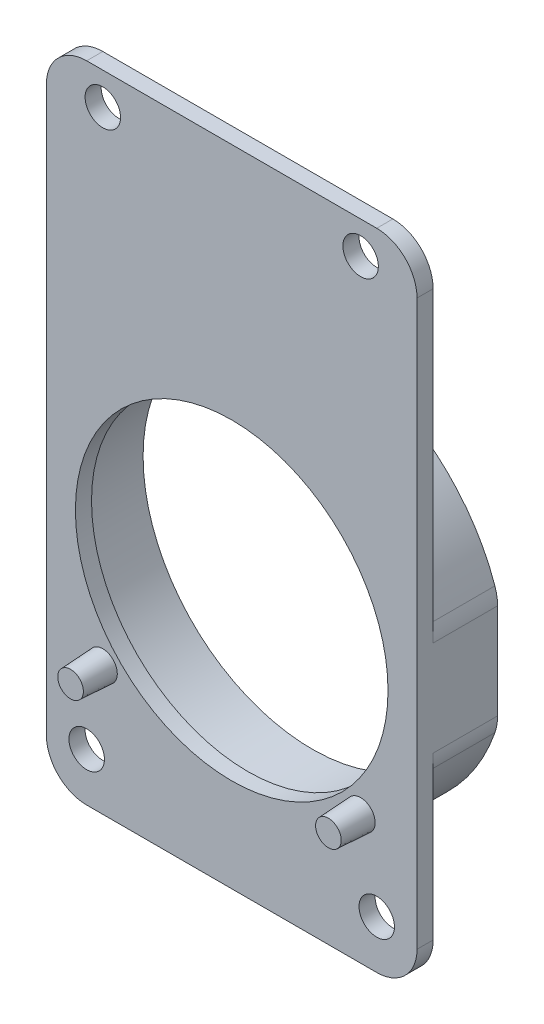
ISO-10303-21;
HEADER;
FILE_DESCRIPTION(('STEP AP214'),'2;1');
FILE_NAME('part.step','',(''),(''),'','','');
FILE_SCHEMA(('AUTOMOTIVE_DESIGN { 1 0 10303 214 1 1 1 1 }'));
ENDSEC;
DATA;
#1=APPLICATION_CONTEXT('core data for automotive mechanical design processes');
#2=APPLICATION_PROTOCOL_DEFINITION('international standard','automotive_design',2000,#1);
#3=PRODUCT_CONTEXT('',#1,'mechanical');
#4=PRODUCT('Part','Part','',(#3));
#5=PRODUCT_RELATED_PRODUCT_CATEGORY('part','',(#4));
#6=PRODUCT_DEFINITION_FORMATION('','',#4);
#7=PRODUCT_DEFINITION_CONTEXT('part definition',#1,'design');
#8=PRODUCT_DEFINITION('design','',#6,#7);
#9=PRODUCT_DEFINITION_SHAPE('','',#8);
#10=(LENGTH_UNIT() NAMED_UNIT(*) SI_UNIT(.MILLI.,.METRE.));
#11=(NAMED_UNIT(*) PLANE_ANGLE_UNIT() SI_UNIT($,.RADIAN.));
#12=(NAMED_UNIT(*) SI_UNIT($,.STERADIAN.) SOLID_ANGLE_UNIT());
#13=UNCERTAINTY_MEASURE_WITH_UNIT(LENGTH_MEASURE(1.E-05),#10,'distance_accuracy_value','');
#14=(GEOMETRIC_REPRESENTATION_CONTEXT(3) GLOBAL_UNCERTAINTY_ASSIGNED_CONTEXT((#13)) GLOBAL_UNIT_ASSIGNED_CONTEXT((#10,
#11,#12)) REPRESENTATION_CONTEXT('',''));
#15=CARTESIAN_POINT('',(0.,0.,0.));
#16=DIRECTION('',(0.,0.,1.));
#17=DIRECTION('',(1.,0.,0.));
#18=AXIS2_PLACEMENT_3D('',#15,#16,#17);
#19=CARTESIAN_POINT('',(0.,0.,0.));
#20=DIRECTION('',(0.,0.,-1.));
#21=DIRECTION('',(-1.,0.,0.));
#22=AXIS2_PLACEMENT_3D('',#19,#20,#21);
#23=PLANE('',#22);
#24=CARTESIAN_POINT('',(0.,0.,0.));
#25=DIRECTION('',(0.,0.,-1.));
#26=DIRECTION('',(-1.,0.,0.));
#27=AXIS2_PLACEMENT_3D('',#24,#25,#26);
#28=CIRCLE('',#27,12.);
#29=CARTESIAN_POINT('',(-11.3333333333333,3.94405318873308,0.));
#30=VERTEX_POINT('',#29);
#31=CARTESIAN_POINT('',(11.3333333333333,3.94405318873308,0.));
#32=VERTEX_POINT('',#31);
#33=EDGE_CURVE('E336',#30,#32,#28,.T.);
#34=ORIENTED_EDGE('',*,*,#33,.F.);
#35=CARTESIAN_POINT('',(-8.5,2.95803989154981,0.));
#36=DIRECTION('',(0.,0.,-1.));
#37=DIRECTION('',(-1.,0.,0.));
#38=AXIS2_PLACEMENT_3D('',#35,#36,#37);
#39=CIRCLE('',#38,3.);
#40=CARTESIAN_POINT('',(-11.5,2.95803989154981,0.));
#41=VERTEX_POINT('',#40);
#42=EDGE_CURVE('E185',#30,#41,#39,.F.);
#43=ORIENTED_EDGE('',*,*,#42,.T.);
#44=DIRECTION('',(0.,-1.,0.));
#45=VECTOR('',#44,1.);
#46=CARTESIAN_POINT('',(-11.5,-15.5,0.));
#47=LINE('',#46,#45);
#48=CARTESIAN_POINT('',(-11.5,22.,0.));
#49=VERTEX_POINT('',#48);
#50=EDGE_CURVE('E175',#49,#41,#47,.T.);
#51=ORIENTED_EDGE('',*,*,#50,.F.);
#52=CARTESIAN_POINT('',(-9.,22.,0.));
#53=DIRECTION('',(0.,0.,-1.));
#54=DIRECTION('',(-1.,0.,0.));
#55=AXIS2_PLACEMENT_3D('',#52,#53,#54);
#56=CIRCLE('',#55,2.5);
#57=CARTESIAN_POINT('',(-9.,24.5,0.));
#58=VERTEX_POINT('',#57);
#59=EDGE_CURVE('E158',#49,#58,#56,.T.);
#60=ORIENTED_EDGE('',*,*,#59,.T.);
#61=DIRECTION('',(-1.,0.,0.));
#62=VECTOR('',#61,1.);
#63=CARTESIAN_POINT('',(-11.5,24.5,0.));
#64=LINE('',#63,#62);
#65=CARTESIAN_POINT('',(9.,24.5,0.));
#66=VERTEX_POINT('',#65);
#67=EDGE_CURVE('E202',#66,#58,#64,.T.);
#68=ORIENTED_EDGE('',*,*,#67,.F.);
#69=CARTESIAN_POINT('',(9.,22.,0.));
#70=DIRECTION('',(0.,0.,-1.));
#71=DIRECTION('',(-1.,0.,0.));
#72=AXIS2_PLACEMENT_3D('',#69,#70,#71);
#73=CIRCLE('',#72,2.5);
#74=CARTESIAN_POINT('',(11.5,22.,0.));
#75=VERTEX_POINT('',#74);
#76=EDGE_CURVE('E169',#66,#75,#73,.T.);
#77=ORIENTED_EDGE('',*,*,#76,.T.);
#78=DIRECTION('',(0.,1.,0.));
#79=VECTOR('',#78,1.);
#80=CARTESIAN_POINT('',(11.5,-15.5,0.));
#81=LINE('',#80,#79);
#82=CARTESIAN_POINT('',(11.5,2.95803989154981,0.));
#83=VERTEX_POINT('',#82);
#84=EDGE_CURVE('E67',#83,#75,#81,.T.);
#85=ORIENTED_EDGE('',*,*,#84,.F.);
#86=CARTESIAN_POINT('',(8.5,2.95803989154981,0.));
#87=DIRECTION('',(0.,0.,-1.));
#88=DIRECTION('',(-1.,0.,0.));
#89=AXIS2_PLACEMENT_3D('',#86,#87,#88);
#90=CIRCLE('',#89,3.);
#91=EDGE_CURVE('E11',#83,#32,#90,.F.);
#92=ORIENTED_EDGE('',*,*,#91,.T.);
#93=EDGE_LOOP('',(#34,#43,#51,#60,#68,#77,#85,#92));
#94=FACE_BOUND('',#93,.T.);
#95=CARTESIAN_POINT('',(8.,22.5,0.));
#96=DIRECTION('',(0.,0.,1.));
#97=DIRECTION('',(1.,0.,0.));
#98=AXIS2_PLACEMENT_3D('',#95,#96,#97);
#99=CIRCLE('',#98,1.1);
#100=CARTESIAN_POINT('',(9.1,22.5,0.));
#101=VERTEX_POINT('',#100);
#102=EDGE_CURVE('E362',#101,#101,#99,.T.);
#103=ORIENTED_EDGE('',*,*,#102,.T.);
#104=EDGE_LOOP('',(#103));
#105=FACE_BOUND('',#104,.T.);
#106=CARTESIAN_POINT('',(-8.,22.5,0.));
#107=DIRECTION('',(0.,0.,1.));
#108=DIRECTION('',(1.,0.,0.));
#109=AXIS2_PLACEMENT_3D('',#106,#107,#108);
#110=CIRCLE('',#109,1.1);
#111=CARTESIAN_POINT('',(-6.9,22.5,0.));
#112=VERTEX_POINT('',#111);
#113=EDGE_CURVE('E354',#112,#112,#110,.T.);
#114=ORIENTED_EDGE('',*,*,#113,.T.);
#115=EDGE_LOOP('',(#114));
#116=FACE_BOUND('',#115,.T.);
#117=ADVANCED_FACE('F44',(#94,#105,#116),#23,.T.);
#118=CARTESIAN_POINT('',(0.,0.,0.));
#119=DIRECTION('',(0.,0.,1.));
#120=DIRECTION('',(1.,0.,0.));
#121=AXIS2_PLACEMENT_3D('',#118,#119,#120);
#122=CIRCLE('',#121,9.7);
#123=CARTESIAN_POINT('',(9.7,0.,0.));
#124=VERTEX_POINT('',#123);
#125=EDGE_CURVE('E195',#124,#124,#122,.T.);
#126=ORIENTED_EDGE('',*,*,#125,.T.);
#127=EDGE_LOOP('',(#126));
#128=FACE_BOUND('',#127,.T.);
#129=CARTESIAN_POINT('',(0.,0.,0.));
#130=DIRECTION('',(0.,0.,-1.));
#131=DIRECTION('',(-1.,0.,0.));
#132=AXIS2_PLACEMENT_3D('',#129,#130,#131);
#133=CIRCLE('',#132,10.5);
#134=CARTESIAN_POINT('',(-10.5,0.,0.));
#135=VERTEX_POINT('',#134);
#136=EDGE_CURVE('E527',#135,#135,#133,.T.);
#137=ORIENTED_EDGE('',*,*,#136,.T.);
#138=EDGE_LOOP('',(#137));
#139=FACE_BOUND('',#138,.T.);
#140=ADVANCED_FACE('F450',(#128,#139),#23,.T.);
#141=CARTESIAN_POINT('',(-11.5,-15.5,1.));
#142=DIRECTION('',(1.,0.,0.));
#143=DIRECTION('',(0.,0.,-1.));
#144=AXIS2_PLACEMENT_3D('',#141,#142,#143);
#145=PLANE('',#144);
#146=DIRECTION('',(0.,1.,0.));
#147=VECTOR('',#146,1.);
#148=CARTESIAN_POINT('',(-11.5,3.42782730020053,-4.));
#149=LINE('',#148,#147);
#150=CARTESIAN_POINT('',(-11.5,-2.95803989154981,-4.));
#151=VERTEX_POINT('',#150);
#152=CARTESIAN_POINT('',(-11.5,2.95803989154981,-4.));
#153=VERTEX_POINT('',#152);
#154=EDGE_CURVE('E327',#151,#153,#149,.T.);
#155=ORIENTED_EDGE('',*,*,#154,.F.);
#156=DIRECTION('',(0.,0.,1.));
#157=VECTOR('',#156,1.);
#158=CARTESIAN_POINT('',(-11.5,-2.95803989154981,1.));
#159=LINE('',#158,#157);
#160=CARTESIAN_POINT('',(-11.5,-2.95803989154981,0.));
#161=VERTEX_POINT('',#160);
#162=EDGE_CURVE('E256',#151,#161,#159,.T.);
#163=ORIENTED_EDGE('',*,*,#162,.T.);
#164=CARTESIAN_POINT('',(-11.5,-13.,0.));
#165=VERTEX_POINT('',#164);
#166=EDGE_CURVE('E189',#161,#165,#47,.T.);
#167=ORIENTED_EDGE('',*,*,#166,.T.);
#168=DIRECTION('',(0.,0.,-1.));
#169=VECTOR('',#168,1.);
#170=CARTESIAN_POINT('',(-11.5,-13.,1.));
#171=LINE('',#170,#169);
#172=CARTESIAN_POINT('',(-11.5,-13.,1.));
#173=VERTEX_POINT('',#172);
#174=EDGE_CURVE('E181',#165,#173,#171,.F.);
#175=ORIENTED_EDGE('',*,*,#174,.T.);
#176=DIRECTION('',(0.,-1.,0.));
#177=VECTOR('',#176,1.);
#178=CARTESIAN_POINT('',(-11.5,-15.5,1.));
#179=LINE('',#178,#177);
#180=CARTESIAN_POINT('',(-11.5,22.,1.));
#181=VERTEX_POINT('',#180);
#182=EDGE_CURVE('E178',#181,#173,#179,.T.);
#183=ORIENTED_EDGE('',*,*,#182,.F.);
#184=DIRECTION('',(0.,0.,-1.));
#185=VECTOR('',#184,1.);
#186=CARTESIAN_POINT('',(-11.5,22.,1.));
#187=LINE('',#186,#185);
#188=EDGE_CURVE('E162',#181,#49,#187,.T.);
#189=ORIENTED_EDGE('',*,*,#188,.T.);
#190=ORIENTED_EDGE('',*,*,#50,.T.);
#191=DIRECTION('',(0.,0.,1.));
#192=VECTOR('',#191,1.);
#193=CARTESIAN_POINT('',(-11.5,2.95803989154981,1.));
#194=LINE('',#193,#192);
#195=EDGE_CURVE('E253',#41,#153,#194,.F.);
#196=ORIENTED_EDGE('',*,*,#195,.T.);
#197=EDGE_LOOP('',(#155,#163,#167,#175,#183,#189,#190,#196));
#198=FACE_BOUND('',#197,.T.);
#199=ADVANCED_FACE('F174',(#198),#145,.F.);
#200=CARTESIAN_POINT('',(-11.5,-15.5,1.));
#201=DIRECTION('',(0.,1.,0.));
#202=DIRECTION('',(0.,0.,1.));
#203=AXIS2_PLACEMENT_3D('',#200,#201,#202);
#204=PLANE('',#203);
#205=DIRECTION('',(1.,0.,0.));
#206=VECTOR('',#205,1.);
#207=CARTESIAN_POINT('',(-11.5,-15.5,0.));
#208=LINE('',#207,#206);
#209=CARTESIAN_POINT('',(-9.,-15.5,0.));
#210=VERTEX_POINT('',#209);
#211=CARTESIAN_POINT('',(9.,-15.5,0.));
#212=VERTEX_POINT('',#211);
#213=EDGE_CURVE('E188',#210,#212,#208,.T.);
#214=ORIENTED_EDGE('',*,*,#213,.T.);
#215=DIRECTION('',(0.,0.,-1.));
#216=VECTOR('',#215,1.);
#217=CARTESIAN_POINT('',(9.,-15.5,1.));
#218=LINE('',#217,#216);
#219=CARTESIAN_POINT('',(9.,-15.5,1.));
#220=VERTEX_POINT('',#219);
#221=EDGE_CURVE('E242',#212,#220,#218,.F.);
#222=ORIENTED_EDGE('',*,*,#221,.T.);
#223=DIRECTION('',(1.,0.,0.));
#224=VECTOR('',#223,1.);
#225=CARTESIAN_POINT('',(-11.5,-15.5,1.));
#226=LINE('',#225,#224);
#227=CARTESIAN_POINT('',(-9.,-15.5,1.));
#228=VERTEX_POINT('',#227);
#229=EDGE_CURVE('E391',#228,#220,#226,.T.);
#230=ORIENTED_EDGE('',*,*,#229,.F.);
#231=DIRECTION('',(0.,0.,-1.));
#232=VECTOR('',#231,1.);
#233=CARTESIAN_POINT('',(-9.,-15.5,1.));
#234=LINE('',#233,#232);
#235=EDGE_CURVE('E238',#228,#210,#234,.T.);
#236=ORIENTED_EDGE('',*,*,#235,.T.);
#237=EDGE_LOOP('',(#214,#222,#230,#236));
#238=FACE_BOUND('',#237,.T.);
#239=ADVANCED_FACE('F436',(#238),#204,.F.);
#240=CARTESIAN_POINT('',(11.5,-15.5,1.));
#241=DIRECTION('',(-1.,0.,0.));
#242=DIRECTION('',(0.,0.,1.));
#243=AXIS2_PLACEMENT_3D('',#240,#241,#242);
#244=PLANE('',#243);
#245=CARTESIAN_POINT('',(11.5,-13.,0.));
#246=VERTEX_POINT('',#245);
#247=CARTESIAN_POINT('',(11.5,-2.95803989154981,0.));
#248=VERTEX_POINT('',#247);
#249=EDGE_CURVE('E60',#246,#248,#81,.T.);
#250=ORIENTED_EDGE('',*,*,#249,.T.);
#251=DIRECTION('',(0.,0.,1.));
#252=VECTOR('',#251,1.);
#253=CARTESIAN_POINT('',(11.5,-2.95803989154981,1.));
#254=LINE('',#253,#252);
#255=CARTESIAN_POINT('',(11.5,-2.95803989154981,-4.));
#256=VERTEX_POINT('',#255);
#257=EDGE_CURVE('E290',#248,#256,#254,.F.);
#258=ORIENTED_EDGE('',*,*,#257,.T.);
#259=DIRECTION('',(0.,-1.,0.));
#260=VECTOR('',#259,1.);
#261=CARTESIAN_POINT('',(11.5,3.42782730020053,-4.));
#262=LINE('',#261,#260);
#263=CARTESIAN_POINT('',(11.5,2.95803989154981,-4.));
#264=VERTEX_POINT('',#263);
#265=EDGE_CURVE('E312',#264,#256,#262,.T.);
#266=ORIENTED_EDGE('',*,*,#265,.F.);
#267=DIRECTION('',(0.,0.,1.));
#268=VECTOR('',#267,1.);
#269=CARTESIAN_POINT('',(11.5,2.95803989154981,1.));
#270=LINE('',#269,#268);
#271=EDGE_CURVE('E286',#264,#83,#270,.T.);
#272=ORIENTED_EDGE('',*,*,#271,.T.);
#273=ORIENTED_EDGE('',*,*,#84,.T.);
#274=DIRECTION('',(0.,0.,-1.));
#275=VECTOR('',#274,1.);
#276=CARTESIAN_POINT('',(11.5,22.,1.));
#277=LINE('',#276,#275);
#278=CARTESIAN_POINT('',(11.5,22.,1.));
#279=VERTEX_POINT('',#278);
#280=EDGE_CURVE('E235',#75,#279,#277,.F.);
#281=ORIENTED_EDGE('',*,*,#280,.T.);
#282=DIRECTION('',(0.,1.,0.));
#283=VECTOR('',#282,1.);
#284=CARTESIAN_POINT('',(11.5,-15.5,1.));
#285=LINE('',#284,#283);
#286=CARTESIAN_POINT('',(11.5,-13.,1.));
#287=VERTEX_POINT('',#286);
#288=EDGE_CURVE('E394',#287,#279,#285,.T.);
#289=ORIENTED_EDGE('',*,*,#288,.F.);
#290=DIRECTION('',(0.,0.,-1.));
#291=VECTOR('',#290,1.);
#292=CARTESIAN_POINT('',(11.5,-13.,1.));
#293=LINE('',#292,#291);
#294=EDGE_CURVE('E232',#287,#246,#293,.T.);
#295=ORIENTED_EDGE('',*,*,#294,.T.);
#296=EDGE_LOOP('',(#250,#258,#266,#272,#273,#281,#289,#295));
#297=FACE_BOUND('',#296,.T.);
#298=ADVANCED_FACE('F311',(#297),#244,.F.);
#299=CARTESIAN_POINT('',(-11.5,24.5,1.));
#300=DIRECTION('',(0.,-1.,0.));
#301=DIRECTION('',(0.,0.,-1.));
#302=AXIS2_PLACEMENT_3D('',#299,#300,#301);
#303=PLANE('',#302);
#304=ORIENTED_EDGE('',*,*,#67,.T.);
#305=DIRECTION('',(0.,0.,-1.));
#306=VECTOR('',#305,1.);
#307=CARTESIAN_POINT('',(-9.,24.5,1.));
#308=LINE('',#307,#306);
#309=CARTESIAN_POINT('',(-9.,24.5,1.));
#310=VERTEX_POINT('',#309);
#311=EDGE_CURVE('E163',#58,#310,#308,.F.);
#312=ORIENTED_EDGE('',*,*,#311,.T.);
#313=DIRECTION('',(-1.,0.,0.));
#314=VECTOR('',#313,1.);
#315=CARTESIAN_POINT('',(-11.5,24.5,1.));
#316=LINE('',#315,#314);
#317=CARTESIAN_POINT('',(9.,24.5,1.));
#318=VERTEX_POINT('',#317);
#319=EDGE_CURVE('E197',#318,#310,#316,.T.);
#320=ORIENTED_EDGE('',*,*,#319,.F.);
#321=DIRECTION('',(0.,0.,-1.));
#322=VECTOR('',#321,1.);
#323=CARTESIAN_POINT('',(9.,24.5,1.));
#324=LINE('',#323,#322);
#325=EDGE_CURVE('E168',#318,#66,#324,.T.);
#326=ORIENTED_EDGE('',*,*,#325,.T.);
#327=EDGE_LOOP('',(#304,#312,#320,#326));
#328=FACE_BOUND('',#327,.T.);
#329=ADVANCED_FACE('F406',(#328),#303,.F.);
#330=CARTESIAN_POINT('',(0.,0.,1.));
#331=DIRECTION('',(0.,0.,-1.));
#332=DIRECTION('',(-1.,0.,0.));
#333=AXIS2_PLACEMENT_3D('',#330,#331,#332);
#334=PLANE('',#333);
#335=CARTESIAN_POINT('',(8.,-7.5,1.));
#336=DIRECTION('',(0.,0.,-1.));
#337=DIRECTION('',(-1.,0.,0.));
#338=AXIS2_PLACEMENT_3D('',#335,#336,#337);
#339=CIRCLE('',#338,0.9);
#340=CARTESIAN_POINT('',(7.1,-7.5,1.));
#341=VERTEX_POINT('',#340);
#342=EDGE_CURVE('E249',#341,#341,#339,.F.);
#343=ORIENTED_EDGE('',*,*,#342,.F.);
#344=EDGE_LOOP('',(#343));
#345=FACE_BOUND('',#344,.T.);
#346=CARTESIAN_POINT('',(-8.,-7.5,1.));
#347=DIRECTION('',(0.,0.,-1.));
#348=DIRECTION('',(-1.,0.,0.));
#349=AXIS2_PLACEMENT_3D('',#346,#347,#348);
#350=CIRCLE('',#349,0.899999999999999);
#351=CARTESIAN_POINT('',(-8.9,-7.5,1.));
#352=VERTEX_POINT('',#351);
#353=EDGE_CURVE('E245',#352,#352,#350,.F.);
#354=ORIENTED_EDGE('',*,*,#353,.F.);
#355=EDGE_LOOP('',(#354));
#356=FACE_BOUND('',#355,.T.);
#357=CARTESIAN_POINT('',(-8.,22.5,1.));
#358=DIRECTION('',(0.,0.,1.));
#359=DIRECTION('',(1.,0.,0.));
#360=AXIS2_PLACEMENT_3D('',#357,#358,#359);
#361=CIRCLE('',#360,1.09999999999999);
#362=CARTESIAN_POINT('',(-6.90000000000002,22.5,1.));
#363=VERTEX_POINT('',#362);
#364=EDGE_CURVE('E350',#363,#363,#361,.T.);
#365=ORIENTED_EDGE('',*,*,#364,.F.);
#366=EDGE_LOOP('',(#365));
#367=FACE_BOUND('',#366,.T.);
#368=CARTESIAN_POINT('',(8.,22.5,1.));
#369=DIRECTION('',(0.,0.,1.));
#370=DIRECTION('',(1.,0.,0.));
#371=AXIS2_PLACEMENT_3D('',#368,#369,#370);
#372=CIRCLE('',#371,1.09999999999999);
#373=CARTESIAN_POINT('',(9.09999999999999,22.5,1.));
#374=VERTEX_POINT('',#373);
#375=EDGE_CURVE('E358',#374,#374,#372,.T.);
#376=ORIENTED_EDGE('',*,*,#375,.F.);
#377=EDGE_LOOP('',(#376));
#378=FACE_BOUND('',#377,.T.);
#379=CARTESIAN_POINT('',(-9.,-12.5,1.));
#380=DIRECTION('',(0.,0.,1.));
#381=DIRECTION('',(1.,0.,0.));
#382=AXIS2_PLACEMENT_3D('',#379,#380,#381);
#383=CIRCLE('',#382,1.09999999999999);
#384=CARTESIAN_POINT('',(-7.90000000000001,-12.5,1.));
#385=VERTEX_POINT('',#384);
#386=EDGE_CURVE('E366',#385,#385,#383,.T.);
#387=ORIENTED_EDGE('',*,*,#386,.F.);
#388=EDGE_LOOP('',(#387));
#389=FACE_BOUND('',#388,.T.);
#390=CARTESIAN_POINT('',(9.,-12.5,1.));
#391=DIRECTION('',(0.,0.,1.));
#392=DIRECTION('',(1.,0.,0.));
#393=AXIS2_PLACEMENT_3D('',#390,#391,#392);
#394=CIRCLE('',#393,1.09999999999999);
#395=CARTESIAN_POINT('',(10.1,-12.5,1.));
#396=VERTEX_POINT('',#395);
#397=EDGE_CURVE('E374',#396,#396,#394,.T.);
#398=ORIENTED_EDGE('',*,*,#397,.F.);
#399=EDGE_LOOP('',(#398));
#400=FACE_BOUND('',#399,.T.);
#401=CARTESIAN_POINT('',(0.,0.,1.));
#402=DIRECTION('',(0.,0.,1.));
#403=DIRECTION('',(1.,0.,0.));
#404=AXIS2_PLACEMENT_3D('',#401,#402,#403);
#405=CIRCLE('',#404,9.7);
#406=CARTESIAN_POINT('',(9.7,0.,1.));
#407=VERTEX_POINT('',#406);
#408=EDGE_CURVE('E382',#407,#407,#405,.T.);
#409=ORIENTED_EDGE('',*,*,#408,.F.);
#410=EDGE_LOOP('',(#409));
#411=FACE_BOUND('',#410,.T.);
#412=ORIENTED_EDGE('',*,*,#319,.T.);
#413=CARTESIAN_POINT('',(-9.,22.,1.));
#414=DIRECTION('',(0.,0.,-1.));
#415=DIRECTION('',(-1.,0.,0.));
#416=AXIS2_PLACEMENT_3D('',#413,#414,#415);
#417=CIRCLE('',#416,2.5);
#418=EDGE_CURVE('E229',#310,#181,#417,.F.);
#419=ORIENTED_EDGE('',*,*,#418,.T.);
#420=ORIENTED_EDGE('',*,*,#182,.T.);
#421=CARTESIAN_POINT('',(-9.,-13.,1.));
#422=DIRECTION('',(0.,0.,-1.));
#423=DIRECTION('',(-1.,0.,0.));
#424=AXIS2_PLACEMENT_3D('',#421,#422,#423);
#425=CIRCLE('',#424,2.5);
#426=EDGE_CURVE('E220',#173,#228,#425,.F.);
#427=ORIENTED_EDGE('',*,*,#426,.T.);
#428=ORIENTED_EDGE('',*,*,#229,.T.);
#429=CARTESIAN_POINT('',(9.,-13.,1.));
#430=DIRECTION('',(0.,0.,-1.));
#431=DIRECTION('',(-1.,0.,0.));
#432=AXIS2_PLACEMENT_3D('',#429,#430,#431);
#433=CIRCLE('',#432,2.5);
#434=EDGE_CURVE('E223',#220,#287,#433,.F.);
#435=ORIENTED_EDGE('',*,*,#434,.T.);
#436=ORIENTED_EDGE('',*,*,#288,.T.);
#437=CARTESIAN_POINT('',(9.,22.,1.));
#438=DIRECTION('',(0.,0.,-1.));
#439=DIRECTION('',(-1.,0.,0.));
#440=AXIS2_PLACEMENT_3D('',#437,#438,#439);
#441=CIRCLE('',#440,2.5);
#442=EDGE_CURVE('E226',#279,#318,#441,.F.);
#443=ORIENTED_EDGE('',*,*,#442,.T.);
#444=EDGE_LOOP('',(#412,#419,#420,#427,#428,#435,#436,#443));
#445=FACE_BOUND('',#444,.T.);
#446=ADVANCED_FACE('F403',(#345,#356,#367,#378,#389,#400,#411,#445),#334,.F.);
#447=CARTESIAN_POINT('',(0.,0.,0.));
#448=DIRECTION('',(0.,0.,-1.));
#449=DIRECTION('',(-1.,0.,0.));
#450=AXIS2_PLACEMENT_3D('',#447,#448,#449);
#451=CIRCLE('',#450,12.);
#452=CARTESIAN_POINT('',(11.3333333333333,-3.94405318873308,0.));
#453=VERTEX_POINT('',#452);
#454=CARTESIAN_POINT('',(-11.3333333333333,-3.94405318873308,0.));
#455=VERTEX_POINT('',#454);
#456=EDGE_CURVE('E304',#453,#455,#451,.T.);
#457=ORIENTED_EDGE('',*,*,#456,.F.);
#458=CARTESIAN_POINT('',(8.5,-2.95803989154981,0.));
#459=DIRECTION('',(0.,0.,-1.));
#460=DIRECTION('',(-1.,0.,0.));
#461=AXIS2_PLACEMENT_3D('',#458,#459,#460);
#462=CIRCLE('',#461,3.);
#463=EDGE_CURVE('E53',#453,#248,#462,.F.);
#464=ORIENTED_EDGE('',*,*,#463,.T.);
#465=ORIENTED_EDGE('',*,*,#249,.F.);
#466=CARTESIAN_POINT('',(9.,-13.,0.));
#467=DIRECTION('',(0.,0.,-1.));
#468=DIRECTION('',(-1.,0.,0.));
#469=AXIS2_PLACEMENT_3D('',#466,#467,#468);
#470=CIRCLE('',#469,2.5);
#471=EDGE_CURVE('E210',#246,#212,#470,.T.);
#472=ORIENTED_EDGE('',*,*,#471,.T.);
#473=ORIENTED_EDGE('',*,*,#213,.F.);
#474=CARTESIAN_POINT('',(-9.,-13.,0.));
#475=DIRECTION('',(0.,0.,-1.));
#476=DIRECTION('',(-1.,0.,0.));
#477=AXIS2_PLACEMENT_3D('',#474,#475,#476);
#478=CIRCLE('',#477,2.5);
#479=EDGE_CURVE('E180',#210,#165,#478,.T.);
#480=ORIENTED_EDGE('',*,*,#479,.T.);
#481=ORIENTED_EDGE('',*,*,#166,.F.);
#482=CARTESIAN_POINT('',(-8.5,-2.95803989154981,0.));
#483=DIRECTION('',(0.,0.,-1.));
#484=DIRECTION('',(-1.,0.,0.));
#485=AXIS2_PLACEMENT_3D('',#482,#483,#484);
#486=CIRCLE('',#485,3.);
#487=EDGE_CURVE('E293',#161,#455,#486,.F.);
#488=ORIENTED_EDGE('',*,*,#487,.T.);
#489=EDGE_LOOP('',(#457,#464,#465,#472,#473,#480,#481,#488));
#490=FACE_BOUND('',#489,.T.);
#491=CARTESIAN_POINT('',(-9.,-12.5,0.));
#492=DIRECTION('',(0.,0.,1.));
#493=DIRECTION('',(1.,0.,0.));
#494=AXIS2_PLACEMENT_3D('',#491,#492,#493);
#495=CIRCLE('',#494,1.1);
#496=CARTESIAN_POINT('',(-7.9,-12.5,0.));
#497=VERTEX_POINT('',#496);
#498=EDGE_CURVE('E370',#497,#497,#495,.T.);
#499=ORIENTED_EDGE('',*,*,#498,.T.);
#500=EDGE_LOOP('',(#499));
#501=FACE_BOUND('',#500,.T.);
#502=CARTESIAN_POINT('',(9.,-12.5,0.));
#503=DIRECTION('',(0.,0.,1.));
#504=DIRECTION('',(1.,0.,0.));
#505=AXIS2_PLACEMENT_3D('',#502,#503,#504);
#506=CIRCLE('',#505,1.1);
#507=CARTESIAN_POINT('',(10.1,-12.5,0.));
#508=VERTEX_POINT('',#507);
#509=EDGE_CURVE('E378',#508,#508,#506,.T.);
#510=ORIENTED_EDGE('',*,*,#509,.T.);
#511=EDGE_LOOP('',(#510));
#512=FACE_BOUND('',#511,.T.);
#513=ADVANCED_FACE('F301',(#490,#501,#512),#23,.T.);
#514=CARTESIAN_POINT('',(0.,0.,0.));
#515=DIRECTION('',(0.,0.,1.));
#516=DIRECTION('',(1.,0.,0.));
#517=AXIS2_PLACEMENT_3D('',#514,#515,#516);
#518=CYLINDRICAL_SURFACE('',#517,9.7);
#519=ORIENTED_EDGE('',*,*,#125,.F.);
#520=EDGE_LOOP('',(#519));
#521=FACE_BOUND('',#520,.T.);
#522=ORIENTED_EDGE('',*,*,#408,.T.);
#523=EDGE_LOOP('',(#522));
#524=FACE_BOUND('',#523,.T.);
#525=ADVANCED_FACE('F461',(#521,#524),#518,.F.);
#526=CARTESIAN_POINT('',(-9.,22.,1.));
#527=DIRECTION('',(0.,0.,-1.));
#528=DIRECTION('',(-1.,0.,0.));
#529=AXIS2_PLACEMENT_3D('',#526,#527,#528);
#530=CYLINDRICAL_SURFACE('',#529,2.5);
#531=ORIENTED_EDGE('',*,*,#418,.F.);
#532=ORIENTED_EDGE('',*,*,#311,.F.);
#533=ORIENTED_EDGE('',*,*,#59,.F.);
#534=ORIENTED_EDGE('',*,*,#188,.F.);
#535=EDGE_LOOP('',(#531,#532,#533,#534));
#536=FACE_BOUND('',#535,.T.);
#537=ADVANCED_FACE('F161',(#536),#530,.T.);
#538=CARTESIAN_POINT('',(9.,22.,1.));
#539=DIRECTION('',(0.,0.,-1.));
#540=DIRECTION('',(-1.,0.,0.));
#541=AXIS2_PLACEMENT_3D('',#538,#539,#540);
#542=CYLINDRICAL_SURFACE('',#541,2.5);
#543=ORIENTED_EDGE('',*,*,#442,.F.);
#544=ORIENTED_EDGE('',*,*,#280,.F.);
#545=ORIENTED_EDGE('',*,*,#76,.F.);
#546=ORIENTED_EDGE('',*,*,#325,.F.);
#547=EDGE_LOOP('',(#543,#544,#545,#546));
#548=FACE_BOUND('',#547,.T.);
#549=ADVANCED_FACE('F408',(#548),#542,.T.);
#550=CARTESIAN_POINT('',(9.,-13.,1.));
#551=DIRECTION('',(0.,0.,-1.));
#552=DIRECTION('',(-1.,0.,0.));
#553=AXIS2_PLACEMENT_3D('',#550,#551,#552);
#554=CYLINDRICAL_SURFACE('',#553,2.5);
#555=ORIENTED_EDGE('',*,*,#434,.F.);
#556=ORIENTED_EDGE('',*,*,#221,.F.);
#557=ORIENTED_EDGE('',*,*,#471,.F.);
#558=ORIENTED_EDGE('',*,*,#294,.F.);
#559=EDGE_LOOP('',(#555,#556,#557,#558));
#560=FACE_BOUND('',#559,.T.);
#561=ADVANCED_FACE('F439',(#560),#554,.T.);
#562=CARTESIAN_POINT('',(-9.,-13.,1.));
#563=DIRECTION('',(0.,0.,-1.));
#564=DIRECTION('',(-1.,0.,0.));
#565=AXIS2_PLACEMENT_3D('',#562,#563,#564);
#566=CYLINDRICAL_SURFACE('',#565,2.5);
#567=ORIENTED_EDGE('',*,*,#426,.F.);
#568=ORIENTED_EDGE('',*,*,#174,.F.);
#569=ORIENTED_EDGE('',*,*,#479,.F.);
#570=ORIENTED_EDGE('',*,*,#235,.F.);
#571=EDGE_LOOP('',(#567,#568,#569,#570));
#572=FACE_BOUND('',#571,.T.);
#573=ADVANCED_FACE('F432',(#572),#566,.T.);
#574=CARTESIAN_POINT('',(9.,-12.5,1.));
#575=DIRECTION('',(0.,0.,1.));
#576=DIRECTION('',(1.,0.,0.));
#577=AXIS2_PLACEMENT_3D('',#574,#575,#576);
#578=CYLINDRICAL_SURFACE('',#577,1.09999999999999);
#579=ORIENTED_EDGE('',*,*,#509,.F.);
#580=EDGE_LOOP('',(#579));
#581=FACE_BOUND('',#580,.T.);
#582=ORIENTED_EDGE('',*,*,#397,.T.);
#583=EDGE_LOOP('',(#582));
#584=FACE_BOUND('',#583,.T.);
#585=ADVANCED_FACE('F446',(#581,#584),#578,.F.);
#586=CARTESIAN_POINT('',(-9.,-12.5,1.));
#587=DIRECTION('',(0.,0.,1.));
#588=DIRECTION('',(1.,0.,0.));
#589=AXIS2_PLACEMENT_3D('',#586,#587,#588);
#590=CYLINDRICAL_SURFACE('',#589,1.09999999999999);
#591=ORIENTED_EDGE('',*,*,#498,.F.);
#592=EDGE_LOOP('',(#591));
#593=FACE_BOUND('',#592,.T.);
#594=ORIENTED_EDGE('',*,*,#386,.T.);
#595=EDGE_LOOP('',(#594));
#596=FACE_BOUND('',#595,.T.);
#597=ADVANCED_FACE('F479',(#593,#596),#590,.F.);
#598=CARTESIAN_POINT('',(8.,22.5,1.));
#599=DIRECTION('',(0.,0.,1.));
#600=DIRECTION('',(1.,0.,0.));
#601=AXIS2_PLACEMENT_3D('',#598,#599,#600);
#602=CYLINDRICAL_SURFACE('',#601,1.09999999999999);
#603=ORIENTED_EDGE('',*,*,#102,.F.);
#604=EDGE_LOOP('',(#603));
#605=FACE_BOUND('',#604,.T.);
#606=ORIENTED_EDGE('',*,*,#375,.T.);
#607=EDGE_LOOP('',(#606));
#608=FACE_BOUND('',#607,.T.);
#609=ADVANCED_FACE('F483',(#605,#608),#602,.F.);
#610=CARTESIAN_POINT('',(-8.,22.5,1.));
#611=DIRECTION('',(0.,0.,1.));
#612=DIRECTION('',(1.,0.,0.));
#613=AXIS2_PLACEMENT_3D('',#610,#611,#612);
#614=CYLINDRICAL_SURFACE('',#613,1.09999999999999);
#615=ORIENTED_EDGE('',*,*,#113,.F.);
#616=EDGE_LOOP('',(#615));
#617=FACE_BOUND('',#616,.T.);
#618=ORIENTED_EDGE('',*,*,#364,.T.);
#619=EDGE_LOOP('',(#618));
#620=FACE_BOUND('',#619,.T.);
#621=ADVANCED_FACE('F487',(#617,#620),#614,.F.);
#622=CARTESIAN_POINT('',(-8.,-7.5,1.));
#623=DIRECTION('',(0.,0.,-1.));
#624=DIRECTION('',(1.,0.,0.));
#625=AXIS2_PLACEMENT_3D('',#622,#623,#624);
#626=CONICAL_SURFACE('',#625,0.899999999999999,0.05235987755983);
#627=CARTESIAN_POINT('',(-8.,-7.5,3.));
#628=DIRECTION('',(0.,0.,1.));
#629=DIRECTION('',(1.,0.,0.));
#630=AXIS2_PLACEMENT_3D('',#627,#628,#629);
#631=CIRCLE('',#630,0.795184441433917);
#632=CARTESIAN_POINT('',(-7.20481555856608,-7.5,3.));
#633=VERTEX_POINT('',#632);
#634=EDGE_CURVE('E346',#633,#633,#631,.T.);
#635=ORIENTED_EDGE('',*,*,#634,.F.);
#636=EDGE_LOOP('',(#635));
#637=FACE_BOUND('',#636,.T.);
#638=ORIENTED_EDGE('',*,*,#353,.T.);
#639=EDGE_LOOP('',(#638));
#640=FACE_BOUND('',#639,.T.);
#641=ADVANCED_FACE('F491',(#637,#640),#626,.T.);
#642=CARTESIAN_POINT('',(-8.,-7.5,3.));
#643=DIRECTION('',(0.,0.,1.));
#644=DIRECTION('',(1.,0.,0.));
#645=AXIS2_PLACEMENT_3D('',#642,#643,#644);
#646=PLANE('',#645);
#647=ORIENTED_EDGE('',*,*,#634,.T.);
#648=EDGE_LOOP('',(#647));
#649=FACE_BOUND('',#648,.T.);
#650=ADVANCED_FACE('F495',(#649),#646,.T.);
#651=CARTESIAN_POINT('',(8.,-7.5,1.));
#652=DIRECTION('',(0.,0.,-1.));
#653=DIRECTION('',(1.,0.,0.));
#654=AXIS2_PLACEMENT_3D('',#651,#652,#653);
#655=CONICAL_SURFACE('',#654,0.9,0.05235987755983);
#656=CARTESIAN_POINT('',(8.,-7.5,3.));
#657=DIRECTION('',(0.,0.,1.));
#658=DIRECTION('',(1.,0.,0.));
#659=AXIS2_PLACEMENT_3D('',#656,#657,#658);
#660=CIRCLE('',#659,0.795184441433917);
#661=CARTESIAN_POINT('',(8.79518444143392,-7.5,3.));
#662=VERTEX_POINT('',#661);
#663=EDGE_CURVE('E335',#662,#662,#660,.T.);
#664=ORIENTED_EDGE('',*,*,#663,.F.);
#665=EDGE_LOOP('',(#664));
#666=FACE_BOUND('',#665,.T.);
#667=ORIENTED_EDGE('',*,*,#342,.T.);
#668=EDGE_LOOP('',(#667));
#669=FACE_BOUND('',#668,.T.);
#670=ADVANCED_FACE('F499',(#666,#669),#655,.T.);
#671=CARTESIAN_POINT('',(8.,-7.5,3.));
#672=DIRECTION('',(0.,0.,1.));
#673=DIRECTION('',(1.,0.,0.));
#674=AXIS2_PLACEMENT_3D('',#671,#672,#673);
#675=PLANE('',#674);
#676=ORIENTED_EDGE('',*,*,#663,.T.);
#677=EDGE_LOOP('',(#676));
#678=FACE_BOUND('',#677,.T.);
#679=ADVANCED_FACE('F501',(#678),#675,.T.);
#680=CARTESIAN_POINT('',(0.,0.,-4.));
#681=DIRECTION('',(0.,0.,-1.));
#682=DIRECTION('',(-1.,0.,0.));
#683=AXIS2_PLACEMENT_3D('',#680,#681,#682);
#684=PLANE('',#683);
#685=CARTESIAN_POINT('',(0.,0.,-4.));
#686=DIRECTION('',(0.,0.,-1.));
#687=DIRECTION('',(-1.,0.,0.));
#688=AXIS2_PLACEMENT_3D('',#685,#686,#687);
#689=CIRCLE('',#688,12.);
#690=CARTESIAN_POINT('',(11.3333333333333,-3.94405318873308,-4.));
#691=VERTEX_POINT('',#690);
#692=CARTESIAN_POINT('',(-11.3333333333333,-3.94405318873308,-4.));
#693=VERTEX_POINT('',#692);
#694=EDGE_CURVE('E322',#691,#693,#689,.T.);
#695=ORIENTED_EDGE('',*,*,#694,.T.);
#696=CARTESIAN_POINT('',(-8.5,-2.95803989154981,-4.));
#697=DIRECTION('',(0.,0.,-1.));
#698=DIRECTION('',(-1.,0.,0.));
#699=AXIS2_PLACEMENT_3D('',#696,#697,#698);
#700=CIRCLE('',#699,3.);
#701=EDGE_CURVE('E276',#693,#151,#700,.T.);
#702=ORIENTED_EDGE('',*,*,#701,.T.);
#703=ORIENTED_EDGE('',*,*,#154,.T.);
#704=CARTESIAN_POINT('',(-8.5,2.95803989154981,-4.));
#705=DIRECTION('',(0.,0.,-1.));
#706=DIRECTION('',(-1.,0.,0.));
#707=AXIS2_PLACEMENT_3D('',#704,#705,#706);
#708=CIRCLE('',#707,3.);
#709=CARTESIAN_POINT('',(-11.3333333333333,3.94405318873308,-4.));
#710=VERTEX_POINT('',#709);
#711=EDGE_CURVE('E273',#153,#710,#708,.T.);
#712=ORIENTED_EDGE('',*,*,#711,.T.);
#713=CARTESIAN_POINT('',(0.,0.,-4.));
#714=DIRECTION('',(0.,0.,-1.));
#715=DIRECTION('',(-1.,0.,0.));
#716=AXIS2_PLACEMENT_3D('',#713,#714,#715);
#717=CIRCLE('',#716,12.);
#718=CARTESIAN_POINT('',(11.3333333333333,3.94405318873308,-4.));
#719=VERTEX_POINT('',#718);
#720=EDGE_CURVE('E323',#710,#719,#717,.T.);
#721=ORIENTED_EDGE('',*,*,#720,.T.);
#722=CARTESIAN_POINT('',(8.5,2.95803989154981,-4.));
#723=DIRECTION('',(0.,0.,-1.));
#724=DIRECTION('',(-1.,0.,0.));
#725=AXIS2_PLACEMENT_3D('',#722,#723,#724);
#726=CIRCLE('',#725,3.);
#727=EDGE_CURVE('E267',#719,#264,#726,.T.);
#728=ORIENTED_EDGE('',*,*,#727,.T.);
#729=ORIENTED_EDGE('',*,*,#265,.T.);
#730=CARTESIAN_POINT('',(8.5,-2.95803989154981,-4.));
#731=DIRECTION('',(0.,0.,-1.));
#732=DIRECTION('',(-1.,0.,0.));
#733=AXIS2_PLACEMENT_3D('',#730,#731,#732);
#734=CIRCLE('',#733,3.);
#735=EDGE_CURVE('E270',#256,#691,#734,.T.);
#736=ORIENTED_EDGE('',*,*,#735,.T.);
#737=EDGE_LOOP('',(#695,#702,#703,#712,#721,#728,#729,#736));
#738=FACE_BOUND('',#737,.T.);
#739=CARTESIAN_POINT('',(0.,0.,-4.));
#740=DIRECTION('',(0.,0.,-1.));
#741=DIRECTION('',(-1.,0.,0.));
#742=AXIS2_PLACEMENT_3D('',#739,#740,#741);
#743=CIRCLE('',#742,10.5);
#744=CARTESIAN_POINT('',(-10.5,0.,-4.));
#745=VERTEX_POINT('',#744);
#746=EDGE_CURVE('E340',#745,#745,#743,.T.);
#747=ORIENTED_EDGE('',*,*,#746,.F.);
#748=EDGE_LOOP('',(#747));
#749=FACE_BOUND('',#748,.T.);
#750=ADVANCED_FACE('F316',(#738,#749),#684,.T.);
#751=CARTESIAN_POINT('',(0.,0.,-4.));
#752=DIRECTION('',(0.,0.,1.));
#753=DIRECTION('',(1.,0.,0.));
#754=AXIS2_PLACEMENT_3D('',#751,#752,#753);
#755=CYLINDRICAL_SURFACE('',#754,12.);
#756=ORIENTED_EDGE('',*,*,#720,.F.);
#757=DIRECTION('',(0.,0.,1.));
#758=VECTOR('',#757,1.);
#759=CARTESIAN_POINT('',(-11.3333333333333,3.94405318873308,-4.));
#760=LINE('',#759,#758);
#761=EDGE_CURVE('E282',#710,#30,#760,.T.);
#762=ORIENTED_EDGE('',*,*,#761,.T.);
#763=ORIENTED_EDGE('',*,*,#33,.T.);
#764=DIRECTION('',(0.,0.,1.));
#765=VECTOR('',#764,1.);
#766=CARTESIAN_POINT('',(11.3333333333333,3.94405318873308,-4.));
#767=LINE('',#766,#765);
#768=EDGE_CURVE('E279',#32,#719,#767,.F.);
#769=ORIENTED_EDGE('',*,*,#768,.T.);
#770=EDGE_LOOP('',(#756,#762,#763,#769));
#771=FACE_BOUND('',#770,.T.);
#772=ADVANCED_FACE('F416',(#771),#755,.T.);
#773=CARTESIAN_POINT('',(0.,0.,-4.));
#774=DIRECTION('',(0.,0.,1.));
#775=DIRECTION('',(1.,0.,0.));
#776=AXIS2_PLACEMENT_3D('',#773,#774,#775);
#777=CYLINDRICAL_SURFACE('',#776,12.);
#778=ORIENTED_EDGE('',*,*,#456,.T.);
#779=DIRECTION('',(0.,0.,1.));
#780=VECTOR('',#779,1.);
#781=CARTESIAN_POINT('',(-11.3333333333333,-3.94405318873308,-4.));
#782=LINE('',#781,#780);
#783=EDGE_CURVE('E264',#455,#693,#782,.F.);
#784=ORIENTED_EDGE('',*,*,#783,.T.);
#785=ORIENTED_EDGE('',*,*,#694,.F.);
#786=DIRECTION('',(0.,0.,1.));
#787=VECTOR('',#786,1.);
#788=CARTESIAN_POINT('',(11.3333333333333,-3.94405318873308,-4.));
#789=LINE('',#788,#787);
#790=EDGE_CURVE('E260',#691,#453,#789,.T.);
#791=ORIENTED_EDGE('',*,*,#790,.T.);
#792=EDGE_LOOP('',(#778,#784,#785,#791));
#793=FACE_BOUND('',#792,.T.);
#794=ADVANCED_FACE('F510',(#793),#777,.T.);
#795=CARTESIAN_POINT('',(0.,0.,-4.));
#796=DIRECTION('',(0.,0.,1.));
#797=DIRECTION('',(1.,0.,0.));
#798=AXIS2_PLACEMENT_3D('',#795,#796,#797);
#799=CYLINDRICAL_SURFACE('',#798,10.5);
#800=ORIENTED_EDGE('',*,*,#746,.T.);
#801=EDGE_LOOP('',(#800));
#802=FACE_BOUND('',#801,.T.);
#803=ORIENTED_EDGE('',*,*,#136,.F.);
#804=EDGE_LOOP('',(#803));
#805=FACE_BOUND('',#804,.T.);
#806=ADVANCED_FACE('F513',(#802,#805),#799,.F.);
#807=CARTESIAN_POINT('',(-8.5,-2.95803989154981,-4.));
#808=DIRECTION('',(0.,0.,1.));
#809=DIRECTION('',(1.,0.,0.));
#810=AXIS2_PLACEMENT_3D('',#807,#808,#809);
#811=CYLINDRICAL_SURFACE('',#810,3.);
#812=ORIENTED_EDGE('',*,*,#701,.F.);
#813=ORIENTED_EDGE('',*,*,#783,.F.);
#814=ORIENTED_EDGE('',*,*,#487,.F.);
#815=ORIENTED_EDGE('',*,*,#162,.F.);
#816=EDGE_LOOP('',(#812,#813,#814,#815));
#817=FACE_BOUND('',#816,.T.);
#818=ADVANCED_FACE('F425',(#817),#811,.T.);
#819=CARTESIAN_POINT('',(-8.5,2.95803989154981,-4.));
#820=DIRECTION('',(0.,0.,1.));
#821=DIRECTION('',(1.,0.,0.));
#822=AXIS2_PLACEMENT_3D('',#819,#820,#821);
#823=CYLINDRICAL_SURFACE('',#822,3.);
#824=ORIENTED_EDGE('',*,*,#711,.F.);
#825=ORIENTED_EDGE('',*,*,#195,.F.);
#826=ORIENTED_EDGE('',*,*,#42,.F.);
#827=ORIENTED_EDGE('',*,*,#761,.F.);
#828=EDGE_LOOP('',(#824,#825,#826,#827));
#829=FACE_BOUND('',#828,.T.);
#830=ADVANCED_FACE('F420',(#829),#823,.T.);
#831=CARTESIAN_POINT('',(8.5,-2.95803989154981,-4.));
#832=DIRECTION('',(0.,0.,1.));
#833=DIRECTION('',(1.,0.,0.));
#834=AXIS2_PLACEMENT_3D('',#831,#832,#833);
#835=CYLINDRICAL_SURFACE('',#834,3.);
#836=ORIENTED_EDGE('',*,*,#735,.F.);
#837=ORIENTED_EDGE('',*,*,#257,.F.);
#838=ORIENTED_EDGE('',*,*,#463,.F.);
#839=ORIENTED_EDGE('',*,*,#790,.F.);
#840=EDGE_LOOP('',(#836,#837,#838,#839));
#841=FACE_BOUND('',#840,.T.);
#842=ADVANCED_FACE('F308',(#841),#835,.T.);
#843=CARTESIAN_POINT('',(8.5,2.95803989154981,-4.));
#844=DIRECTION('',(0.,0.,1.));
#845=DIRECTION('',(1.,0.,0.));
#846=AXIS2_PLACEMENT_3D('',#843,#844,#845);
#847=CYLINDRICAL_SURFACE('',#846,3.);
#848=ORIENTED_EDGE('',*,*,#727,.F.);
#849=ORIENTED_EDGE('',*,*,#768,.F.);
#850=ORIENTED_EDGE('',*,*,#91,.F.);
#851=ORIENTED_EDGE('',*,*,#271,.F.);
#852=EDGE_LOOP('',(#848,#849,#850,#851));
#853=FACE_BOUND('',#852,.T.);
#854=ADVANCED_FACE('F46',(#853),#847,.T.);
#855=CLOSED_SHELL('',(#117,#140,#199,#239,#298,#329,#446,#513,#525,#537,#549,#561,#573,#585,
#597,#609,#621,#641,#650,#670,#679,#750,#772,#794,#806,#818,#830,#842,#854));
#856=MANIFOLD_SOLID_BREP('B2',#855);
#857=ADVANCED_BREP_SHAPE_REPRESENTATION('',(#18,#856),#14);
#858=SHAPE_DEFINITION_REPRESENTATION(#9,#857);
ENDSEC;
END-ISO-10303-21;
